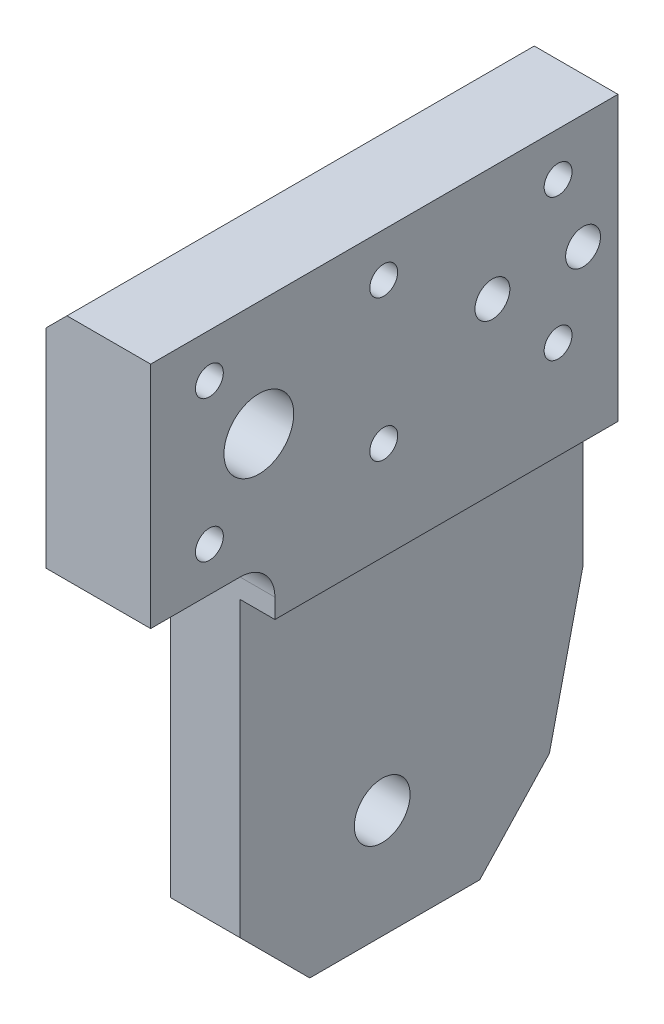
ISO-10303-21;
HEADER;
FILE_DESCRIPTION(('STEP AP214'),'2;1');
FILE_NAME('part.step','',(''),(''),'','','');
FILE_SCHEMA(('AUTOMOTIVE_DESIGN { 1 0 10303 214 1 1 1 1 }'));
ENDSEC;
DATA;
#1=APPLICATION_CONTEXT('core data for automotive mechanical design processes');
#2=APPLICATION_PROTOCOL_DEFINITION('international standard','automotive_design',2000,#1);
#3=PRODUCT_CONTEXT('',#1,'mechanical');
#4=PRODUCT('Part','Part','',(#3));
#5=PRODUCT_RELATED_PRODUCT_CATEGORY('part','',(#4));
#6=PRODUCT_DEFINITION_FORMATION('','',#4);
#7=PRODUCT_DEFINITION_CONTEXT('part definition',#1,'design');
#8=PRODUCT_DEFINITION('design','',#6,#7);
#9=PRODUCT_DEFINITION_SHAPE('','',#8);
#10=(LENGTH_UNIT() NAMED_UNIT(*) SI_UNIT(.MILLI.,.METRE.));
#11=(NAMED_UNIT(*) PLANE_ANGLE_UNIT() SI_UNIT($,.RADIAN.));
#12=(NAMED_UNIT(*) SI_UNIT($,.STERADIAN.) SOLID_ANGLE_UNIT());
#13=UNCERTAINTY_MEASURE_WITH_UNIT(LENGTH_MEASURE(1.E-05),#10,'distance_accuracy_value','');
#14=(GEOMETRIC_REPRESENTATION_CONTEXT(3) GLOBAL_UNCERTAINTY_ASSIGNED_CONTEXT((#13)) GLOBAL_UNIT_ASSIGNED_CONTEXT((#10,
#11,#12)) REPRESENTATION_CONTEXT('',''));
#15=CARTESIAN_POINT('',(0.,0.,0.));
#16=DIRECTION('',(0.,0.,1.));
#17=DIRECTION('',(1.,0.,0.));
#18=AXIS2_PLACEMENT_3D('',#15,#16,#17);
#19=CARTESIAN_POINT('',(0.,-6.08081400829714,16.));
#20=DIRECTION('',(-1.,0.,0.));
#21=DIRECTION('',(0.,0.,1.));
#22=AXIS2_PLACEMENT_3D('',#19,#20,#21);
#23=CYLINDRICAL_SURFACE('',#22,2.);
#24=CARTESIAN_POINT('',(0.,-6.08081400829714,16.));
#25=DIRECTION('',(-1.,0.,0.));
#26=DIRECTION('',(0.,0.,1.));
#27=AXIS2_PLACEMENT_3D('',#24,#25,#26);
#28=CIRCLE('',#27,2.);
#29=CARTESIAN_POINT('',(0.,-6.08081400829714,18.));
#30=VERTEX_POINT('',#29);
#31=EDGE_CURVE('E325',#30,#30,#28,.T.);
#32=ORIENTED_EDGE('',*,*,#31,.F.);
#33=EDGE_LOOP('',(#32));
#34=FACE_BOUND('',#33,.T.);
#35=CARTESIAN_POINT('',(-13.5,-6.08081400829714,16.));
#36=DIRECTION('',(-1.,0.,0.));
#37=DIRECTION('',(0.,0.,1.));
#38=AXIS2_PLACEMENT_3D('',#35,#36,#37);
#39=CIRCLE('',#38,2.);
#40=CARTESIAN_POINT('',(-13.5,-6.08081400829714,18.));
#41=VERTEX_POINT('',#40);
#42=EDGE_CURVE('E241',#41,#41,#39,.F.);
#43=ORIENTED_EDGE('',*,*,#42,.F.);
#44=EDGE_LOOP('',(#43));
#45=FACE_BOUND('',#44,.T.);
#46=ADVANCED_FACE('F31',(#34,#45),#23,.F.);
#47=CARTESIAN_POINT('',(0.,-6.08081400829714,-9.));
#48=DIRECTION('',(-1.,0.,0.));
#49=DIRECTION('',(0.,0.,1.));
#50=AXIS2_PLACEMENT_3D('',#47,#48,#49);
#51=CYLINDRICAL_SURFACE('',#50,2.);
#52=CARTESIAN_POINT('',(0.,-6.08081400829714,-9.));
#53=DIRECTION('',(-1.,0.,0.));
#54=DIRECTION('',(0.,0.,1.));
#55=AXIS2_PLACEMENT_3D('',#52,#53,#54);
#56=CIRCLE('',#55,2.);
#57=CARTESIAN_POINT('',(0.,-6.08081400829714,-7.));
#58=VERTEX_POINT('',#57);
#59=EDGE_CURVE('E322',#58,#58,#56,.T.);
#60=ORIENTED_EDGE('',*,*,#59,.F.);
#61=EDGE_LOOP('',(#60));
#62=FACE_BOUND('',#61,.T.);
#63=CARTESIAN_POINT('',(-13.5,-6.08081400829714,-9.));
#64=DIRECTION('',(-1.,0.,0.));
#65=DIRECTION('',(0.,0.,1.));
#66=AXIS2_PLACEMENT_3D('',#63,#64,#65);
#67=CIRCLE('',#66,2.);
#68=CARTESIAN_POINT('',(-13.5,-6.08081400829714,-7.));
#69=VERTEX_POINT('',#68);
#70=EDGE_CURVE('E236',#69,#69,#67,.F.);
#71=ORIENTED_EDGE('',*,*,#70,.F.);
#72=EDGE_LOOP('',(#71));
#73=FACE_BOUND('',#72,.T.);
#74=ADVANCED_FACE('F398',(#62,#73),#51,.F.);
#75=CARTESIAN_POINT('',(0.,-6.08081400829714,-34.));
#76=DIRECTION('',(-1.,0.,0.));
#77=DIRECTION('',(0.,0.,1.));
#78=AXIS2_PLACEMENT_3D('',#75,#76,#77);
#79=CYLINDRICAL_SURFACE('',#78,2.);
#80=CARTESIAN_POINT('',(0.,-6.08081400829714,-34.));
#81=DIRECTION('',(-1.,0.,0.));
#82=DIRECTION('',(0.,0.,1.));
#83=AXIS2_PLACEMENT_3D('',#80,#81,#82);
#84=CIRCLE('',#83,2.);
#85=CARTESIAN_POINT('',(0.,-6.08081400829714,-32.));
#86=VERTEX_POINT('',#85);
#87=EDGE_CURVE('E317',#86,#86,#84,.T.);
#88=ORIENTED_EDGE('',*,*,#87,.F.);
#89=EDGE_LOOP('',(#88));
#90=FACE_BOUND('',#89,.T.);
#91=CARTESIAN_POINT('',(-13.5,-6.08081400829714,-34.));
#92=DIRECTION('',(-1.,0.,0.));
#93=DIRECTION('',(0.,0.,1.));
#94=AXIS2_PLACEMENT_3D('',#91,#92,#93);
#95=CIRCLE('',#94,2.);
#96=CARTESIAN_POINT('',(-13.5,-6.08081400829714,-32.));
#97=VERTEX_POINT('',#96);
#98=EDGE_CURVE('E231',#97,#97,#95,.F.);
#99=ORIENTED_EDGE('',*,*,#98,.F.);
#100=EDGE_LOOP('',(#99));
#101=FACE_BOUND('',#100,.T.);
#102=ADVANCED_FACE('F404',(#90,#101),#79,.F.);
#103=CARTESIAN_POINT('',(-15.,-60.8316637705877,-42.5815650244091));
#104=DIRECTION('',(0.,-0.224807713484508,-0.974403146525024));
#105=DIRECTION('',(0.,0.974403146525024,-0.224807713484508));
#106=AXIS2_PLACEMENT_3D('',#103,#104,#105);
#107=PLANE('',#106);
#108=DIRECTION('',(0.,0.974403146525024,-0.224807713484508));
#109=VECTOR('',#108,1.);
#110=CARTESIAN_POINT('',(-5.00435815666289,-60.8316637705877,-42.5815650244091));
#111=LINE('',#110,#109);
#112=CARTESIAN_POINT('',(-5.00435815666289,-81.7242328947424,-37.7613725708355));
#113=VERTEX_POINT('',#112);
#114=CARTESIAN_POINT('',(-5.00435815666289,-60.8316637705877,-42.5815650244091));
#115=VERTEX_POINT('',#114);
#116=EDGE_CURVE('E134',#113,#115,#111,.T.);
#117=ORIENTED_EDGE('',*,*,#116,.F.);
#118=DIRECTION('',(-1.,0.,0.));
#119=VECTOR('',#118,1.);
#120=CARTESIAN_POINT('',(-15.,-81.7242328947424,-37.7613725708355));
#121=LINE('',#120,#119);
#122=CARTESIAN_POINT('',(-15.,-81.7242328947424,-37.7613725708355));
#123=VERTEX_POINT('',#122);
#124=EDGE_CURVE('E217',#113,#123,#121,.T.);
#125=ORIENTED_EDGE('',*,*,#124,.T.);
#126=DIRECTION('',(0.,0.974403146525024,-0.224807713484508));
#127=VECTOR('',#126,1.);
#128=CARTESIAN_POINT('',(-15.,-60.8316637705877,-42.5815650244091));
#129=LINE('',#128,#127);
#130=CARTESIAN_POINT('',(-15.,-60.8316637705877,-42.5815650244091));
#131=VERTEX_POINT('',#130);
#132=EDGE_CURVE('E164',#123,#131,#129,.T.);
#133=ORIENTED_EDGE('',*,*,#132,.T.);
#134=DIRECTION('',(1.,0.,0.));
#135=VECTOR('',#134,1.);
#136=CARTESIAN_POINT('',(-15.,-60.8316637705877,-42.5815650244091));
#137=LINE('',#136,#135);
#138=EDGE_CURVE('E179',#131,#115,#137,.T.);
#139=ORIENTED_EDGE('',*,*,#138,.T.);
#140=EDGE_LOOP('',(#117,#125,#133,#139));
#141=FACE_BOUND('',#140,.T.);
#142=ADVANCED_FACE('F299',(#141),#107,.T.);
#143=CARTESIAN_POINT('',(-15.,-92.4426675065177,6.60217121011694));
#144=DIRECTION('',(0.,-1.,0.));
#145=DIRECTION('',(0.,0.,-1.));
#146=AXIS2_PLACEMENT_3D('',#143,#144,#145);
#147=PLANE('',#146);
#148=DIRECTION('',(0.,0.,-1.));
#149=VECTOR('',#148,1.);
#150=CARTESIAN_POINT('',(-15.,-92.4426675065177,6.60217121011694));
#151=LINE('',#150,#149);
#152=CARTESIAN_POINT('',(-15.,-92.4426675065177,-3.39782878988313));
#153=VERTEX_POINT('',#152);
#154=CARTESIAN_POINT('',(-15.,-92.4426675065177,-27.7692181074474));
#155=VERTEX_POINT('',#154);
#156=EDGE_CURVE('E176',#153,#155,#151,.T.);
#157=ORIENTED_EDGE('',*,*,#156,.T.);
#158=DIRECTION('',(1.,0.,0.));
#159=VECTOR('',#158,1.);
#160=CARTESIAN_POINT('',(-15.,-92.4426675065177,-27.7692181074474));
#161=LINE('',#160,#159);
#162=CARTESIAN_POINT('',(-5.00435815666289,-92.4426675065177,-27.7692181074474));
#163=VERTEX_POINT('',#162);
#164=EDGE_CURVE('E212',#155,#163,#161,.T.);
#165=ORIENTED_EDGE('',*,*,#164,.T.);
#166=DIRECTION('',(0.,0.,-1.));
#167=VECTOR('',#166,1.);
#168=CARTESIAN_POINT('',(-5.00435815666289,-92.4426675065177,6.60217121011694));
#169=LINE('',#168,#167);
#170=CARTESIAN_POINT('',(-5.00435815666289,-92.4426675065177,-3.39782878988312));
#171=VERTEX_POINT('',#170);
#172=EDGE_CURVE('E158',#171,#163,#169,.T.);
#173=ORIENTED_EDGE('',*,*,#172,.F.);
#174=DIRECTION('',(-1.,0.,0.));
#175=VECTOR('',#174,1.);
#176=CARTESIAN_POINT('',(-15.,-92.4426675065177,-3.39782878988312));
#177=LINE('',#176,#175);
#178=EDGE_CURVE('E207',#171,#153,#177,.T.);
#179=ORIENTED_EDGE('',*,*,#178,.T.);
#180=EDGE_LOOP('',(#157,#165,#173,#179));
#181=FACE_BOUND('',#180,.T.);
#182=ADVANCED_FACE('F285',(#181),#147,.T.);
#183=CARTESIAN_POINT('',(-15.,-92.4426675065177,6.60217121011694));
#184=DIRECTION('',(0.,0.,1.));
#185=DIRECTION('',(1.,0.,0.));
#186=AXIS2_PLACEMENT_3D('',#183,#184,#185);
#187=PLANE('',#186);
#188=DIRECTION('',(0.,-1.,0.));
#189=VECTOR('',#188,1.);
#190=CARTESIAN_POINT('',(0.,-92.4426675065177,6.60217121011694));
#191=LINE('',#190,#189);
#192=CARTESIAN_POINT('',(0.,-37.6500207262163,6.60217121011694));
#193=VERTEX_POINT('',#192);
#194=CARTESIAN_POINT('',(0.,-40.4274289166685,6.60217121011694));
#195=VERTEX_POINT('',#194);
#196=EDGE_CURVE('E167',#193,#195,#191,.T.);
#197=ORIENTED_EDGE('',*,*,#196,.F.);
#198=DIRECTION('',(1.,0.,0.));
#199=VECTOR('',#198,1.);
#200=CARTESIAN_POINT('',(-15.,-37.6500207262163,6.60217121011694));
#201=LINE('',#200,#199);
#202=CARTESIAN_POINT('',(-15.,-37.6500207262163,6.60217121011694));
#203=VERTEX_POINT('',#202);
#204=EDGE_CURVE('E224',#193,#203,#201,.F.);
#205=ORIENTED_EDGE('',*,*,#204,.T.);
#206=DIRECTION('',(0.,-1.,0.));
#207=VECTOR('',#206,1.);
#208=CARTESIAN_POINT('',(-15.,-92.4426675065177,6.60217121011694));
#209=LINE('',#208,#207);
#210=CARTESIAN_POINT('',(-15.,-82.4426675065177,6.60217121011694));
#211=VERTEX_POINT('',#210);
#212=EDGE_CURVE('E174',#203,#211,#209,.T.);
#213=ORIENTED_EDGE('',*,*,#212,.T.);
#214=DIRECTION('',(1.,0.,0.));
#215=VECTOR('',#214,1.);
#216=CARTESIAN_POINT('',(-15.,-82.4426675065177,6.60217121011694));
#217=LINE('',#216,#215);
#218=CARTESIAN_POINT('',(-5.00435815666289,-82.4426675065177,6.60217121011694));
#219=VERTEX_POINT('',#218);
#220=EDGE_CURVE('E202',#211,#219,#217,.T.);
#221=ORIENTED_EDGE('',*,*,#220,.T.);
#222=DIRECTION('',(0.,-1.,0.));
#223=VECTOR('',#222,1.);
#224=CARTESIAN_POINT('',(-5.00435815666289,-92.4426675065177,6.60217121011694));
#225=LINE('',#224,#223);
#226=CARTESIAN_POINT('',(-5.00435815666289,-40.4274289166685,6.60217121011694));
#227=VERTEX_POINT('',#226);
#228=EDGE_CURVE('E154',#227,#219,#225,.T.);
#229=ORIENTED_EDGE('',*,*,#228,.F.);
#230=DIRECTION('',(-1.,0.,0.));
#231=VECTOR('',#230,1.);
#232=CARTESIAN_POINT('',(-15.,-40.4274289166685,6.60217121011694));
#233=LINE('',#232,#231);
#234=EDGE_CURVE('E147',#195,#227,#233,.T.);
#235=ORIENTED_EDGE('',*,*,#234,.F.);
#236=EDGE_LOOP('',(#197,#205,#213,#221,#229,#235));
#237=FACE_BOUND('',#236,.T.);
#238=ADVANCED_FACE('F278',(#237),#187,.T.);
#239=CARTESIAN_POINT('',(-15.,-32.6500207262163,24.4184349755909));
#240=DIRECTION('',(0.,-1.,0.));
#241=DIRECTION('',(0.,0.,-1.));
#242=AXIS2_PLACEMENT_3D('',#239,#240,#241);
#243=PLANE('',#242);
#244=DIRECTION('',(0.,0.,-1.));
#245=VECTOR('',#244,1.);
#246=CARTESIAN_POINT('',(-15.,-32.6500207262163,24.4184349755909));
#247=LINE('',#246,#245);
#248=CARTESIAN_POINT('',(-15.,-32.6500207262163,24.4184349755909));
#249=VERTEX_POINT('',#248);
#250=CARTESIAN_POINT('',(-15.,-32.6500207262163,11.6021712101169));
#251=VERTEX_POINT('',#250);
#252=EDGE_CURVE('E171',#249,#251,#247,.T.);
#253=ORIENTED_EDGE('',*,*,#252,.T.);
#254=DIRECTION('',(1.,0.,0.));
#255=VECTOR('',#254,1.);
#256=CARTESIAN_POINT('',(0.,-32.6500207262163,11.6021712101169));
#257=LINE('',#256,#255);
#258=CARTESIAN_POINT('',(0.,-32.6500207262163,11.6021712101169));
#259=VERTEX_POINT('',#258);
#260=EDGE_CURVE('E221',#251,#259,#257,.T.);
#261=ORIENTED_EDGE('',*,*,#260,.T.);
#262=DIRECTION('',(0.,0.,-1.));
#263=VECTOR('',#262,1.);
#264=CARTESIAN_POINT('',(0.,-32.6500207262163,24.4184349755909));
#265=LINE('',#264,#263);
#266=CARTESIAN_POINT('',(0.,-32.6500207262163,24.4184349755909));
#267=VERTEX_POINT('',#266);
#268=EDGE_CURVE('E187',#267,#259,#265,.T.);
#269=ORIENTED_EDGE('',*,*,#268,.F.);
#270=DIRECTION('',(1.,0.,0.));
#271=VECTOR('',#270,1.);
#272=CARTESIAN_POINT('',(-15.,-32.6500207262163,24.4184349755909));
#273=LINE('',#272,#271);
#274=EDGE_CURVE('E191',#249,#267,#273,.T.);
#275=ORIENTED_EDGE('',*,*,#274,.F.);
#276=EDGE_LOOP('',(#253,#261,#269,#275));
#277=FACE_BOUND('',#276,.T.);
#278=ADVANCED_FACE('F620',(#277),#243,.T.);
#279=CARTESIAN_POINT('',(-15.,-32.6500207262163,24.4184349755909));
#280=DIRECTION('',(0.,3.31181144600806E-10,1.));
#281=DIRECTION('',(0.,-1.,3.31181144600806E-10));
#282=AXIS2_PLACEMENT_3D('',#279,#280,#281);
#283=PLANE('',#282);
#284=DIRECTION('',(1.,0.,0.));
#285=VECTOR('',#284,1.);
#286=CARTESIAN_POINT('',(-15.,0.195067042427263,24.4184349647132));
#287=LINE('',#286,#285);
#288=CARTESIAN_POINT('',(-12.,0.195067042427265,24.4184349647132));
#289=VERTEX_POINT('',#288);
#290=CARTESIAN_POINT('',(0.,0.195067042427263,24.4184349647132));
#291=VERTEX_POINT('',#290);
#292=EDGE_CURVE('E194',#289,#291,#287,.T.);
#293=ORIENTED_EDGE('',*,*,#292,.F.);
#294=DIRECTION('',(-0.707106781186548,-0.707106781186548,2.34180433148352E-10));
#295=VECTOR('',#294,1.);
#296=CARTESIAN_POINT('',(-29.9225438843218,-17.7274768418945,24.4184349706489));
#297=LINE('',#296,#295);
#298=CARTESIAN_POINT('',(-15.,-2.80493295757274,24.4184349657068));
#299=VERTEX_POINT('',#298);
#300=EDGE_CURVE('E53',#289,#299,#297,.T.);
#301=ORIENTED_EDGE('',*,*,#300,.T.);
#302=DIRECTION('',(0.,-1.,3.31181144600806E-10));
#303=VECTOR('',#302,1.);
#304=CARTESIAN_POINT('',(-15.,-32.6500207262163,24.4184349755909));
#305=LINE('',#304,#303);
#306=EDGE_CURVE('E169',#299,#249,#305,.T.);
#307=ORIENTED_EDGE('',*,*,#306,.T.);
#308=ORIENTED_EDGE('',*,*,#274,.T.);
#309=DIRECTION('',(0.,-1.,3.31181144600806E-10));
#310=VECTOR('',#309,1.);
#311=CARTESIAN_POINT('',(0.,-32.6500207262163,24.4184349755909));
#312=LINE('',#311,#310);
#313=EDGE_CURVE('E184',#291,#267,#312,.T.);
#314=ORIENTED_EDGE('',*,*,#313,.F.);
#315=EDGE_LOOP('',(#293,#301,#307,#308,#314));
#316=FACE_BOUND('',#315,.T.);
#317=ADVANCED_FACE('F271',(#316),#283,.T.);
#318=CARTESIAN_POINT('',(-15.,0.195067042427263,24.4184349647132));
#319=DIRECTION('',(0.,1.,0.));
#320=DIRECTION('',(0.,0.,1.));
#321=AXIS2_PLACEMENT_3D('',#318,#319,#320);
#322=PLANE('',#321);
#323=DIRECTION('',(1.,0.,0.));
#324=VECTOR('',#323,1.);
#325=CARTESIAN_POINT('',(-15.,0.195067042427263,-42.5815650244091));
#326=LINE('',#325,#324);
#327=CARTESIAN_POINT('',(-12.,0.195067042427263,-42.5815650244091));
#328=VERTEX_POINT('',#327);
#329=CARTESIAN_POINT('',(0.,0.195067042427263,-42.5815650244091));
#330=VERTEX_POINT('',#329);
#331=EDGE_CURVE('E196',#328,#330,#326,.T.);
#332=ORIENTED_EDGE('',*,*,#331,.F.);
#333=DIRECTION('',(0.,0.,1.));
#334=VECTOR('',#333,1.);
#335=CARTESIAN_POINT('',(-12.,0.195067042427263,24.4184349647132));
#336=LINE('',#335,#334);
#337=EDGE_CURVE('E230',#328,#289,#336,.T.);
#338=ORIENTED_EDGE('',*,*,#337,.T.);
#339=ORIENTED_EDGE('',*,*,#292,.T.);
#340=DIRECTION('',(0.,0.,1.));
#341=VECTOR('',#340,1.);
#342=CARTESIAN_POINT('',(0.,0.195067042427263,24.4184349647132));
#343=LINE('',#342,#341);
#344=EDGE_CURVE('E181',#330,#291,#343,.T.);
#345=ORIENTED_EDGE('',*,*,#344,.F.);
#346=EDGE_LOOP('',(#332,#338,#339,#345));
#347=FACE_BOUND('',#346,.T.);
#348=ADVANCED_FACE('F266',(#347),#322,.T.);
#349=CARTESIAN_POINT('',(-15.,0.195067042427263,-42.5815650244091));
#350=DIRECTION('',(0.,0.,-1.));
#351=DIRECTION('',(0.,1.,0.));
#352=AXIS2_PLACEMENT_3D('',#349,#350,#351);
#353=PLANE('',#352);
#354=DIRECTION('',(0.,1.,0.));
#355=VECTOR('',#354,1.);
#356=CARTESIAN_POINT('',(-15.,0.195067042427263,-42.5815650244091));
#357=LINE('',#356,#355);
#358=CARTESIAN_POINT('',(-15.,-2.80493295757274,-42.5815650244091));
#359=VERTEX_POINT('',#358);
#360=EDGE_CURVE('E166',#131,#359,#357,.T.);
#361=ORIENTED_EDGE('',*,*,#360,.T.);
#362=DIRECTION('',(0.707106781186548,0.707106781186548,0.));
#363=VECTOR('',#362,1.);
#364=CARTESIAN_POINT('',(-13.5,-1.30493295757274,-42.5815650244091));
#365=LINE('',#364,#363);
#366=EDGE_CURVE('E11',#359,#328,#365,.T.);
#367=ORIENTED_EDGE('',*,*,#366,.T.);
#368=ORIENTED_EDGE('',*,*,#331,.T.);
#369=DIRECTION('',(0.,1.,0.));
#370=VECTOR('',#369,1.);
#371=CARTESIAN_POINT('',(0.,0.195067042427263,-42.5815650244091));
#372=LINE('',#371,#370);
#373=CARTESIAN_POINT('',(0.,-40.4274289166685,-42.5815650244091));
#374=VERTEX_POINT('',#373);
#375=EDGE_CURVE('E153',#374,#330,#372,.T.);
#376=ORIENTED_EDGE('',*,*,#375,.F.);
#377=DIRECTION('',(1.,0.,0.));
#378=VECTOR('',#377,1.);
#379=CARTESIAN_POINT('',(-15.,-40.4274289166685,-42.5815650244091));
#380=LINE('',#379,#378);
#381=CARTESIAN_POINT('',(-5.00435815666289,-40.4274289166685,-42.5815650244091));
#382=VERTEX_POINT('',#381);
#383=EDGE_CURVE('E144',#382,#374,#380,.T.);
#384=ORIENTED_EDGE('',*,*,#383,.F.);
#385=DIRECTION('',(0.,1.,0.));
#386=VECTOR('',#385,1.);
#387=CARTESIAN_POINT('',(-5.00435815666289,0.195067042427263,-42.5815650244091));
#388=LINE('',#387,#386);
#389=EDGE_CURVE('E125',#115,#382,#388,.T.);
#390=ORIENTED_EDGE('',*,*,#389,.F.);
#391=ORIENTED_EDGE('',*,*,#138,.F.);
#392=EDGE_LOOP('',(#361,#367,#368,#376,#384,#390,#391));
#393=FACE_BOUND('',#392,.T.);
#394=ADVANCED_FACE('F151',(#393),#353,.T.);
#395=CARTESIAN_POINT('',(-15.,-92.4426675065177,-35.2884877225059));
#396=DIRECTION('',(1.,0.,0.));
#397=DIRECTION('',(0.,0.,-1.));
#398=AXIS2_PLACEMENT_3D('',#395,#396,#397);
#399=PLANE('',#398);
#400=CARTESIAN_POINT('',(-15.,-26.3741397165486,-34.));
#401=DIRECTION('',(-1.,0.,0.));
#402=DIRECTION('',(0.,0.,-1.));
#403=AXIS2_PLACEMENT_3D('',#400,#401,#402);
#404=CIRCLE('',#403,3.);
#405=CARTESIAN_POINT('',(-15.,-26.3741397165486,-37.));
#406=VERTEX_POINT('',#405);
#407=EDGE_CURVE('E358',#406,#406,#404,.T.);
#408=ORIENTED_EDGE('',*,*,#407,.F.);
#409=EDGE_LOOP('',(#408));
#410=FACE_BOUND('',#409,.T.);
#411=CARTESIAN_POINT('',(-15.,-26.3741397165486,-9.));
#412=DIRECTION('',(-1.,0.,0.));
#413=DIRECTION('',(0.,0.,-1.));
#414=AXIS2_PLACEMENT_3D('',#411,#412,#413);
#415=CIRCLE('',#414,3.);
#416=CARTESIAN_POINT('',(-15.,-26.3741397165486,-12.));
#417=VERTEX_POINT('',#416);
#418=EDGE_CURVE('E259',#417,#417,#415,.T.);
#419=ORIENTED_EDGE('',*,*,#418,.F.);
#420=EDGE_LOOP('',(#419));
#421=FACE_BOUND('',#420,.T.);
#422=CARTESIAN_POINT('',(-15.,-26.3741397165486,16.));
#423=DIRECTION('',(-1.,0.,0.));
#424=DIRECTION('',(0.,0.,-1.));
#425=AXIS2_PLACEMENT_3D('',#422,#423,#424);
#426=CIRCLE('',#425,3.);
#427=CARTESIAN_POINT('',(-15.,-26.3741397165486,13.));
#428=VERTEX_POINT('',#427);
#429=EDGE_CURVE('E254',#428,#428,#426,.T.);
#430=ORIENTED_EDGE('',*,*,#429,.F.);
#431=EDGE_LOOP('',(#430));
#432=FACE_BOUND('',#431,.T.);
#433=CARTESIAN_POINT('',(-15.,-6.08081400829714,16.));
#434=DIRECTION('',(-1.,0.,0.));
#435=DIRECTION('',(0.,0.,1.));
#436=AXIS2_PLACEMENT_3D('',#433,#434,#435);
#437=CIRCLE('',#436,3.);
#438=CARTESIAN_POINT('',(-15.,-6.08081400829714,19.));
#439=VERTEX_POINT('',#438);
#440=EDGE_CURVE('E249',#439,#439,#437,.T.);
#441=ORIENTED_EDGE('',*,*,#440,.F.);
#442=EDGE_LOOP('',(#441));
#443=FACE_BOUND('',#442,.T.);
#444=CARTESIAN_POINT('',(-15.,-6.08081400829714,-9.));
#445=DIRECTION('',(-1.,0.,0.));
#446=DIRECTION('',(0.,0.,1.));
#447=AXIS2_PLACEMENT_3D('',#444,#445,#446);
#448=CIRCLE('',#447,3.);
#449=CARTESIAN_POINT('',(-15.,-6.08081400829714,-6.));
#450=VERTEX_POINT('',#449);
#451=EDGE_CURVE('E244',#450,#450,#448,.T.);
#452=ORIENTED_EDGE('',*,*,#451,.F.);
#453=EDGE_LOOP('',(#452));
#454=FACE_BOUND('',#453,.T.);
#455=CARTESIAN_POINT('',(-15.,-6.08081400829714,-34.));
#456=DIRECTION('',(-1.,0.,0.));
#457=DIRECTION('',(0.,0.,1.));
#458=AXIS2_PLACEMENT_3D('',#455,#456,#457);
#459=CIRCLE('',#458,3.);
#460=CARTESIAN_POINT('',(-15.,-6.08081400829714,-31.));
#461=VERTEX_POINT('',#460);
#462=EDGE_CURVE('E239',#461,#461,#459,.T.);
#463=ORIENTED_EDGE('',*,*,#462,.F.);
#464=EDGE_LOOP('',(#463));
#465=FACE_BOUND('',#464,.T.);
#466=CARTESIAN_POINT('',(-15.,-16.2274768624229,-24.5815650541918));
#467=DIRECTION('',(-1.,0.,0.));
#468=DIRECTION('',(0.,0.,1.));
#469=AXIS2_PLACEMENT_3D('',#466,#467,#468);
#470=CIRCLE('',#469,2.5);
#471=CARTESIAN_POINT('',(-15.,-16.2274768624229,-22.0815650541918));
#472=VERTEX_POINT('',#471);
#473=EDGE_CURVE('E314',#472,#472,#470,.T.);
#474=ORIENTED_EDGE('',*,*,#473,.F.);
#475=EDGE_LOOP('',(#474));
#476=FACE_BOUND('',#475,.T.);
#477=CARTESIAN_POINT('',(-15.,-16.2274768624229,-37.5815650541918));
#478=DIRECTION('',(-1.,0.,0.));
#479=DIRECTION('',(0.,0.,1.));
#480=AXIS2_PLACEMENT_3D('',#477,#478,#479);
#481=CIRCLE('',#480,2.49999999999999);
#482=CARTESIAN_POINT('',(-15.,-16.2274768624229,-35.0815650541918));
#483=VERTEX_POINT('',#482);
#484=EDGE_CURVE('E308',#483,#483,#481,.T.);
#485=ORIENTED_EDGE('',*,*,#484,.F.);
#486=EDGE_LOOP('',(#485));
#487=FACE_BOUND('',#486,.T.);
#488=CARTESIAN_POINT('',(-15.,-16.2274768470333,8.90469038538057));
#489=DIRECTION('',(-1.,0.,0.));
#490=DIRECTION('',(0.,0.,1.));
#491=AXIS2_PLACEMENT_3D('',#488,#489,#490);
#492=CIRCLE('',#491,5.00000000000015);
#493=CARTESIAN_POINT('',(-15.,-16.2274768470333,13.9046903853807));
#494=VERTEX_POINT('',#493);
#495=EDGE_CURVE('E302',#494,#494,#492,.T.);
#496=ORIENTED_EDGE('',*,*,#495,.F.);
#497=EDGE_LOOP('',(#496));
#498=FACE_BOUND('',#497,.T.);
#499=CARTESIAN_POINT('',(-15.,-76.8340024966243,-13.784244496519));
#500=DIRECTION('',(1.,0.,0.));
#501=DIRECTION('',(0.,0.,-1.));
#502=AXIS2_PLACEMENT_3D('',#499,#500,#501);
#503=CIRCLE('',#502,4.);
#504=CARTESIAN_POINT('',(-15.,-76.8340024966243,-17.7842444965191));
#505=VERTEX_POINT('',#504);
#506=EDGE_CURVE('E156',#505,#505,#503,.T.);
#507=ORIENTED_EDGE('',*,*,#506,.T.);
#508=EDGE_LOOP('',(#507));
#509=FACE_BOUND('',#508,.T.);
#510=ORIENTED_EDGE('',*,*,#306,.F.);
#511=DIRECTION('',(0.,0.,-1.));
#512=VECTOR('',#511,1.);
#513=CARTESIAN_POINT('',(-15.,-2.80493295757274,-42.5815650244091));
#514=LINE('',#513,#512);
#515=EDGE_CURVE('E39',#299,#359,#514,.T.);
#516=ORIENTED_EDGE('',*,*,#515,.T.);
#517=ORIENTED_EDGE('',*,*,#360,.F.);
#518=ORIENTED_EDGE('',*,*,#132,.F.);
#519=DIRECTION('',(0.,0.731454021675909,-0.681890764106788));
#520=VECTOR('',#519,1.);
#521=CARTESIAN_POINT('',(-15.,-92.4426675065177,-27.7692181074474));
#522=LINE('',#521,#520);
#523=EDGE_CURVE('E219',#123,#155,#522,.F.);
#524=ORIENTED_EDGE('',*,*,#523,.T.);
#525=ORIENTED_EDGE('',*,*,#156,.F.);
#526=DIRECTION('',(0.,-0.707106781186546,-0.70710678118655));
#527=VECTOR('',#526,1.);
#528=CARTESIAN_POINT('',(-15.,-82.4426675065177,6.60217121011694));
#529=LINE('',#528,#527);
#530=EDGE_CURVE('E209',#153,#211,#529,.F.);
#531=ORIENTED_EDGE('',*,*,#530,.T.);
#532=ORIENTED_EDGE('',*,*,#212,.F.);
#533=CARTESIAN_POINT('',(-15.,-37.6500207262163,11.6021712101169));
#534=DIRECTION('',(1.,0.,0.));
#535=DIRECTION('',(0.,0.,-1.));
#536=AXIS2_PLACEMENT_3D('',#533,#534,#535);
#537=CIRCLE('',#536,5.);
#538=EDGE_CURVE('E228',#203,#251,#537,.T.);
#539=ORIENTED_EDGE('',*,*,#538,.T.);
#540=ORIENTED_EDGE('',*,*,#252,.F.);
#541=EDGE_LOOP('',(#510,#516,#517,#518,#524,#525,#531,#532,#539,#540));
#542=FACE_BOUND('',#541,.T.);
#543=ADVANCED_FACE('F291',(#410,#421,#432,#443,#454,#465,#476,#487,#498,#509,#542),#399,.F.);
#544=CARTESIAN_POINT('',(0.,-92.4426675065177,-35.2884877225059));
#545=DIRECTION('',(1.,0.,0.));
#546=DIRECTION('',(0.,0.,-1.));
#547=AXIS2_PLACEMENT_3D('',#544,#545,#546);
#548=PLANE('',#547);
#549=CARTESIAN_POINT('',(0.,-26.3741397165486,-34.));
#550=DIRECTION('',(-1.,0.,0.));
#551=DIRECTION('',(0.,0.,-1.));
#552=AXIS2_PLACEMENT_3D('',#549,#550,#551);
#553=CIRCLE('',#552,2.);
#554=CARTESIAN_POINT('',(0.,-26.3741397165486,-36.));
#555=VERTEX_POINT('',#554);
#556=EDGE_CURVE('E234',#555,#555,#553,.T.);
#557=ORIENTED_EDGE('',*,*,#556,.T.);
#558=EDGE_LOOP('',(#557));
#559=FACE_BOUND('',#558,.T.);
#560=CARTESIAN_POINT('',(0.,-26.3741397165486,-9.));
#561=DIRECTION('',(-1.,0.,0.));
#562=DIRECTION('',(0.,0.,-1.));
#563=AXIS2_PLACEMENT_3D('',#560,#561,#562);
#564=CIRCLE('',#563,2.);
#565=CARTESIAN_POINT('',(0.,-26.3741397165486,-11.));
#566=VERTEX_POINT('',#565);
#567=EDGE_CURVE('E331',#566,#566,#564,.T.);
#568=ORIENTED_EDGE('',*,*,#567,.T.);
#569=EDGE_LOOP('',(#568));
#570=FACE_BOUND('',#569,.T.);
#571=CARTESIAN_POINT('',(0.,-26.3741397165486,16.));
#572=DIRECTION('',(-1.,0.,0.));
#573=DIRECTION('',(0.,0.,-1.));
#574=AXIS2_PLACEMENT_3D('',#571,#572,#573);
#575=CIRCLE('',#574,2.);
#576=CARTESIAN_POINT('',(0.,-26.3741397165486,14.));
#577=VERTEX_POINT('',#576);
#578=EDGE_CURVE('E328',#577,#577,#575,.T.);
#579=ORIENTED_EDGE('',*,*,#578,.T.);
#580=EDGE_LOOP('',(#579));
#581=FACE_BOUND('',#580,.T.);
#582=ORIENTED_EDGE('',*,*,#31,.T.);
#583=EDGE_LOOP('',(#582));
#584=FACE_BOUND('',#583,.T.);
#585=ORIENTED_EDGE('',*,*,#59,.T.);
#586=EDGE_LOOP('',(#585));
#587=FACE_BOUND('',#586,.T.);
#588=ORIENTED_EDGE('',*,*,#87,.T.);
#589=EDGE_LOOP('',(#588));
#590=FACE_BOUND('',#589,.T.);
#591=CARTESIAN_POINT('',(0.,-16.2274768624229,-24.5815650541918));
#592=DIRECTION('',(-1.,0.,0.));
#593=DIRECTION('',(0.,0.,1.));
#594=AXIS2_PLACEMENT_3D('',#591,#592,#593);
#595=CIRCLE('',#594,2.5);
#596=CARTESIAN_POINT('',(0.,-16.2274768624229,-22.0815650541918));
#597=VERTEX_POINT('',#596);
#598=EDGE_CURVE('E311',#597,#597,#595,.T.);
#599=ORIENTED_EDGE('',*,*,#598,.T.);
#600=EDGE_LOOP('',(#599));
#601=FACE_BOUND('',#600,.T.);
#602=CARTESIAN_POINT('',(0.,-16.2274768624229,-37.5815650541918));
#603=DIRECTION('',(-1.,0.,0.));
#604=DIRECTION('',(0.,0.,1.));
#605=AXIS2_PLACEMENT_3D('',#602,#603,#604);
#606=CIRCLE('',#605,2.49999999999999);
#607=CARTESIAN_POINT('',(0.,-16.2274768624229,-35.0815650541918));
#608=VERTEX_POINT('',#607);
#609=EDGE_CURVE('E305',#608,#608,#606,.T.);
#610=ORIENTED_EDGE('',*,*,#609,.T.);
#611=EDGE_LOOP('',(#610));
#612=FACE_BOUND('',#611,.T.);
#613=CARTESIAN_POINT('',(0.,-16.2274768470333,8.90469038538057));
#614=DIRECTION('',(-1.,0.,0.));
#615=DIRECTION('',(0.,0.,1.));
#616=AXIS2_PLACEMENT_3D('',#613,#614,#615);
#617=CIRCLE('',#616,5.00000000000015);
#618=CARTESIAN_POINT('',(0.,-16.2274768470333,13.9046903853807));
#619=VERTEX_POINT('',#618);
#620=EDGE_CURVE('E148',#619,#619,#617,.T.);
#621=ORIENTED_EDGE('',*,*,#620,.T.);
#622=EDGE_LOOP('',(#621));
#623=FACE_BOUND('',#622,.T.);
#624=DIRECTION('',(0.,0.,1.));
#625=VECTOR('',#624,1.);
#626=CARTESIAN_POINT('',(0.,-40.4274289166685,-35.2884877225059));
#627=LINE('',#626,#625);
#628=EDGE_CURVE('E193',#374,#195,#627,.T.);
#629=ORIENTED_EDGE('',*,*,#628,.F.);
#630=ORIENTED_EDGE('',*,*,#375,.T.);
#631=ORIENTED_EDGE('',*,*,#344,.T.);
#632=ORIENTED_EDGE('',*,*,#313,.T.);
#633=ORIENTED_EDGE('',*,*,#268,.T.);
#634=CARTESIAN_POINT('',(0.,-37.6500207262163,11.6021712101169));
#635=DIRECTION('',(1.,0.,0.));
#636=DIRECTION('',(0.,0.,-1.));
#637=AXIS2_PLACEMENT_3D('',#634,#635,#636);
#638=CIRCLE('',#637,5.);
#639=EDGE_CURVE('E226',#259,#193,#638,.F.);
#640=ORIENTED_EDGE('',*,*,#639,.T.);
#641=ORIENTED_EDGE('',*,*,#196,.T.);
#642=EDGE_LOOP('',(#629,#630,#631,#632,#633,#640,#641));
#643=FACE_BOUND('',#642,.T.);
#644=ADVANCED_FACE('F275',(#559,#570,#581,#584,#587,#590,#601,#612,#623,#643),#548,.T.);
#645=CARTESIAN_POINT('',(-15.,-76.8340024966243,-13.784244496519));
#646=DIRECTION('',(1.,0.,0.));
#647=DIRECTION('',(0.,0.,-1.));
#648=AXIS2_PLACEMENT_3D('',#645,#646,#647);
#649=CYLINDRICAL_SURFACE('',#648,4.);
#650=CARTESIAN_POINT('',(-5.00435815666289,-76.8340024966243,-13.784244496519));
#651=DIRECTION('',(-1.,0.,0.));
#652=DIRECTION('',(0.,0.,1.));
#653=AXIS2_PLACEMENT_3D('',#650,#651,#652);
#654=CIRCLE('',#653,4.);
#655=CARTESIAN_POINT('',(-5.00435815666289,-76.8340024966243,-9.78424449651905));
#656=VERTEX_POINT('',#655);
#657=EDGE_CURVE('E139',#656,#656,#654,.F.);
#658=ORIENTED_EDGE('',*,*,#657,.T.);
#659=EDGE_LOOP('',(#658));
#660=FACE_BOUND('',#659,.T.);
#661=ORIENTED_EDGE('',*,*,#506,.F.);
#662=EDGE_LOOP('',(#661));
#663=FACE_BOUND('',#662,.T.);
#664=ADVANCED_FACE('F385',(#660,#663),#649,.F.);
#665=CARTESIAN_POINT('',(-5.00435815666289,-40.4274289166685,-55.));
#666=DIRECTION('',(-1.,0.,0.));
#667=DIRECTION('',(0.,0.,1.));
#668=AXIS2_PLACEMENT_3D('',#665,#666,#667);
#669=PLANE('',#668);
#670=ORIENTED_EDGE('',*,*,#172,.T.);
#671=DIRECTION('',(0.,-0.731454021675909,0.681890764106788));
#672=VECTOR('',#671,1.);
#673=CARTESIAN_POINT('',(-5.00435815666289,-92.4426675065177,-27.7692181074474));
#674=LINE('',#673,#672);
#675=EDGE_CURVE('E215',#163,#113,#674,.F.);
#676=ORIENTED_EDGE('',*,*,#675,.T.);
#677=ORIENTED_EDGE('',*,*,#116,.T.);
#678=ORIENTED_EDGE('',*,*,#389,.T.);
#679=DIRECTION('',(0.,0.,1.));
#680=VECTOR('',#679,1.);
#681=CARTESIAN_POINT('',(-5.00435815666289,-40.4274289166685,-55.));
#682=LINE('',#681,#680);
#683=EDGE_CURVE('E131',#382,#227,#682,.T.);
#684=ORIENTED_EDGE('',*,*,#683,.T.);
#685=ORIENTED_EDGE('',*,*,#228,.T.);
#686=DIRECTION('',(0.,0.707106781186546,0.707106781186549));
#687=VECTOR('',#686,1.);
#688=CARTESIAN_POINT('',(-5.00435815666289,-82.4426675065177,6.60217121011694));
#689=LINE('',#688,#687);
#690=EDGE_CURVE('E205',#219,#171,#689,.F.);
#691=ORIENTED_EDGE('',*,*,#690,.T.);
#692=EDGE_LOOP('',(#670,#676,#677,#678,#684,#685,#691));
#693=FACE_BOUND('',#692,.T.);
#694=ORIENTED_EDGE('',*,*,#657,.F.);
#695=EDGE_LOOP('',(#694));
#696=FACE_BOUND('',#695,.T.);
#697=ADVANCED_FACE('F128',(#693,#696),#669,.F.);
#698=CARTESIAN_POINT('',(1.4631591119979,-40.4274289166685,-55.));
#699=DIRECTION('',(0.,1.,0.));
#700=DIRECTION('',(0.,0.,1.));
#701=AXIS2_PLACEMENT_3D('',#698,#699,#700);
#702=PLANE('',#701);
#703=ORIENTED_EDGE('',*,*,#234,.T.);
#704=ORIENTED_EDGE('',*,*,#683,.F.);
#705=ORIENTED_EDGE('',*,*,#383,.T.);
#706=ORIENTED_EDGE('',*,*,#628,.T.);
#707=EDGE_LOOP('',(#703,#704,#705,#706));
#708=FACE_BOUND('',#707,.T.);
#709=ADVANCED_FACE('F142',(#708),#702,.F.);
#710=CARTESIAN_POINT('',(0.,-16.2274768470333,8.90469038538057));
#711=DIRECTION('',(-1.,0.,0.));
#712=DIRECTION('',(0.,0.,1.));
#713=AXIS2_PLACEMENT_3D('',#710,#711,#712);
#714=CYLINDRICAL_SURFACE('',#713,5.00000000000015);
#715=ORIENTED_EDGE('',*,*,#620,.F.);
#716=EDGE_LOOP('',(#715));
#717=FACE_BOUND('',#716,.T.);
#718=ORIENTED_EDGE('',*,*,#495,.T.);
#719=EDGE_LOOP('',(#718));
#720=FACE_BOUND('',#719,.T.);
#721=ADVANCED_FACE('F423',(#717,#720),#714,.F.);
#722=CARTESIAN_POINT('',(0.,-16.2274768624229,-37.5815650541918));
#723=DIRECTION('',(-1.,0.,0.));
#724=DIRECTION('',(0.,0.,1.));
#725=AXIS2_PLACEMENT_3D('',#722,#723,#724);
#726=CYLINDRICAL_SURFACE('',#725,2.49999999999999);
#727=ORIENTED_EDGE('',*,*,#609,.F.);
#728=EDGE_LOOP('',(#727));
#729=FACE_BOUND('',#728,.T.);
#730=ORIENTED_EDGE('',*,*,#484,.T.);
#731=EDGE_LOOP('',(#730));
#732=FACE_BOUND('',#731,.T.);
#733=ADVANCED_FACE('F419',(#729,#732),#726,.F.);
#734=CARTESIAN_POINT('',(0.,-16.2274768624229,-24.5815650541918));
#735=DIRECTION('',(-1.,0.,0.));
#736=DIRECTION('',(0.,0.,1.));
#737=AXIS2_PLACEMENT_3D('',#734,#735,#736);
#738=CYLINDRICAL_SURFACE('',#737,2.5);
#739=ORIENTED_EDGE('',*,*,#598,.F.);
#740=EDGE_LOOP('',(#739));
#741=FACE_BOUND('',#740,.T.);
#742=ORIENTED_EDGE('',*,*,#473,.T.);
#743=EDGE_LOOP('',(#742));
#744=FACE_BOUND('',#743,.T.);
#745=ADVANCED_FACE('F416',(#741,#744),#738,.F.);
#746=CARTESIAN_POINT('',(-15.,-82.4426675065177,6.60217121011694));
#747=DIRECTION('',(0.,0.707106781186549,-0.707106781186545));
#748=DIRECTION('',(0.,0.707106781186546,0.707106781186549));
#749=AXIS2_PLACEMENT_3D('',#746,#747,#748);
#750=PLANE('',#749);
#751=ORIENTED_EDGE('',*,*,#530,.F.);
#752=ORIENTED_EDGE('',*,*,#178,.F.);
#753=ORIENTED_EDGE('',*,*,#690,.F.);
#754=ORIENTED_EDGE('',*,*,#220,.F.);
#755=EDGE_LOOP('',(#751,#752,#753,#754));
#756=FACE_BOUND('',#755,.T.);
#757=ADVANCED_FACE('F289',(#756),#750,.F.);
#758=CARTESIAN_POINT('',(-15.,-92.4426675065177,-27.7692181074474));
#759=DIRECTION('',(0.,0.681890764106788,0.731454021675909));
#760=DIRECTION('',(0.,-0.731454021675909,0.681890764106788));
#761=AXIS2_PLACEMENT_3D('',#758,#759,#760);
#762=PLANE('',#761);
#763=ORIENTED_EDGE('',*,*,#523,.F.);
#764=ORIENTED_EDGE('',*,*,#124,.F.);
#765=ORIENTED_EDGE('',*,*,#675,.F.);
#766=ORIENTED_EDGE('',*,*,#164,.F.);
#767=EDGE_LOOP('',(#763,#764,#765,#766));
#768=FACE_BOUND('',#767,.T.);
#769=ADVANCED_FACE('F296',(#768),#762,.F.);
#770=CARTESIAN_POINT('',(-15.,-37.6500207262163,11.6021712101169));
#771=DIRECTION('',(-1.,0.,0.));
#772=DIRECTION('',(0.,0.,1.));
#773=AXIS2_PLACEMENT_3D('',#770,#771,#772);
#774=CYLINDRICAL_SURFACE('',#773,5.);
#775=ORIENTED_EDGE('',*,*,#538,.F.);
#776=ORIENTED_EDGE('',*,*,#204,.F.);
#777=ORIENTED_EDGE('',*,*,#639,.F.);
#778=ORIENTED_EDGE('',*,*,#260,.F.);
#779=EDGE_LOOP('',(#775,#776,#777,#778));
#780=FACE_BOUND('',#779,.T.);
#781=ADVANCED_FACE('F457',(#780),#774,.F.);
#782=CARTESIAN_POINT('',(0.,-26.3741397165486,16.));
#783=DIRECTION('',(-1.,0.,0.));
#784=DIRECTION('',(0.,0.,1.));
#785=AXIS2_PLACEMENT_3D('',#782,#783,#784);
#786=CYLINDRICAL_SURFACE('',#785,2.);
#787=CARTESIAN_POINT('',(-13.5,-26.3741397165486,16.));
#788=DIRECTION('',(1.,0.,0.));
#789=DIRECTION('',(0.,0.,-1.));
#790=AXIS2_PLACEMENT_3D('',#787,#788,#789);
#791=CIRCLE('',#790,2.);
#792=CARTESIAN_POINT('',(-13.5,-26.3741397165486,14.));
#793=VERTEX_POINT('',#792);
#794=EDGE_CURVE('E246',#793,#793,#791,.F.);
#795=ORIENTED_EDGE('',*,*,#794,.T.);
#796=EDGE_LOOP('',(#795));
#797=FACE_BOUND('',#796,.T.);
#798=ORIENTED_EDGE('',*,*,#578,.F.);
#799=EDGE_LOOP('',(#798));
#800=FACE_BOUND('',#799,.T.);
#801=ADVANCED_FACE('F410',(#797,#800),#786,.F.);
#802=CARTESIAN_POINT('',(0.,-26.3741397165486,-9.));
#803=DIRECTION('',(-1.,0.,0.));
#804=DIRECTION('',(0.,0.,1.));
#805=AXIS2_PLACEMENT_3D('',#802,#803,#804);
#806=CYLINDRICAL_SURFACE('',#805,2.);
#807=CARTESIAN_POINT('',(-13.5,-26.3741397165486,-9.));
#808=DIRECTION('',(1.,0.,0.));
#809=DIRECTION('',(0.,0.,-1.));
#810=AXIS2_PLACEMENT_3D('',#807,#808,#809);
#811=CIRCLE('',#810,2.);
#812=CARTESIAN_POINT('',(-13.5,-26.3741397165486,-11.));
#813=VERTEX_POINT('',#812);
#814=EDGE_CURVE('E251',#813,#813,#811,.F.);
#815=ORIENTED_EDGE('',*,*,#814,.T.);
#816=EDGE_LOOP('',(#815));
#817=FACE_BOUND('',#816,.T.);
#818=ORIENTED_EDGE('',*,*,#567,.F.);
#819=EDGE_LOOP('',(#818));
#820=FACE_BOUND('',#819,.T.);
#821=ADVANCED_FACE('F473',(#817,#820),#806,.F.);
#822=CARTESIAN_POINT('',(0.,-26.3741397165486,-34.));
#823=DIRECTION('',(-1.,0.,0.));
#824=DIRECTION('',(0.,0.,1.));
#825=AXIS2_PLACEMENT_3D('',#822,#823,#824);
#826=CYLINDRICAL_SURFACE('',#825,2.);
#827=CARTESIAN_POINT('',(-13.5,-26.3741397165486,-34.));
#828=DIRECTION('',(1.,0.,0.));
#829=DIRECTION('',(0.,0.,-1.));
#830=AXIS2_PLACEMENT_3D('',#827,#828,#829);
#831=CIRCLE('',#830,2.);
#832=CARTESIAN_POINT('',(-13.5,-26.3741397165486,-36.));
#833=VERTEX_POINT('',#832);
#834=EDGE_CURVE('E256',#833,#833,#831,.F.);
#835=ORIENTED_EDGE('',*,*,#834,.T.);
#836=EDGE_LOOP('',(#835));
#837=FACE_BOUND('',#836,.T.);
#838=ORIENTED_EDGE('',*,*,#556,.F.);
#839=EDGE_LOOP('',(#838));
#840=FACE_BOUND('',#839,.T.);
#841=ADVANCED_FACE('F481',(#837,#840),#826,.F.);
#842=CARTESIAN_POINT('',(-13.5,-6.08081400829714,-34.));
#843=DIRECTION('',(-1.,0.,0.));
#844=DIRECTION('',(0.,0.,1.));
#845=AXIS2_PLACEMENT_3D('',#842,#843,#844);
#846=PLANE('',#845);
#847=CARTESIAN_POINT('',(-13.5,-6.08081400829714,-34.));
#848=DIRECTION('',(-1.,0.,0.));
#849=DIRECTION('',(0.,0.,1.));
#850=AXIS2_PLACEMENT_3D('',#847,#848,#849);
#851=CIRCLE('',#850,2.02588861020373);
#852=CARTESIAN_POINT('',(-13.5,-6.08081400829714,-31.9741113897963));
#853=VERTEX_POINT('',#852);
#854=EDGE_CURVE('E235',#853,#853,#851,.T.);
#855=ORIENTED_EDGE('',*,*,#854,.T.);
#856=EDGE_LOOP('',(#855));
#857=FACE_BOUND('',#856,.T.);
#858=ORIENTED_EDGE('',*,*,#98,.T.);
#859=EDGE_LOOP('',(#858));
#860=FACE_BOUND('',#859,.T.);
#861=ADVANCED_FACE('F488',(#857,#860),#846,.T.);
#862=CARTESIAN_POINT('',(-15.,-6.08081400829714,-34.));
#863=DIRECTION('',(-1.,0.,0.));
#864=DIRECTION('',(0.,0.,1.));
#865=AXIS2_PLACEMENT_3D('',#862,#863,#864);
#866=CONICAL_SURFACE('',#865,3.,0.575958653158129);
#867=ORIENTED_EDGE('',*,*,#854,.F.);
#868=EDGE_LOOP('',(#867));
#869=FACE_BOUND('',#868,.T.);
#870=ORIENTED_EDGE('',*,*,#462,.T.);
#871=EDGE_LOOP('',(#870));
#872=FACE_BOUND('',#871,.T.);
#873=ADVANCED_FACE('F496',(#869,#872),#866,.F.);
#874=CARTESIAN_POINT('',(-13.5,-6.08081400829714,-9.));
#875=DIRECTION('',(-1.,0.,0.));
#876=DIRECTION('',(0.,0.,1.));
#877=AXIS2_PLACEMENT_3D('',#874,#875,#876);
#878=PLANE('',#877);
#879=CARTESIAN_POINT('',(-13.5,-6.08081400829714,-9.));
#880=DIRECTION('',(-1.,0.,0.));
#881=DIRECTION('',(0.,0.,1.));
#882=AXIS2_PLACEMENT_3D('',#879,#880,#881);
#883=CIRCLE('',#882,2.02588861020373);
#884=CARTESIAN_POINT('',(-13.5,-6.08081400829714,-6.97411138979627));
#885=VERTEX_POINT('',#884);
#886=EDGE_CURVE('E240',#885,#885,#883,.T.);
#887=ORIENTED_EDGE('',*,*,#886,.T.);
#888=EDGE_LOOP('',(#887));
#889=FACE_BOUND('',#888,.T.);
#890=ORIENTED_EDGE('',*,*,#70,.T.);
#891=EDGE_LOOP('',(#890));
#892=FACE_BOUND('',#891,.T.);
#893=ADVANCED_FACE('F504',(#889,#892),#878,.T.);
#894=CARTESIAN_POINT('',(-15.,-6.08081400829714,-9.));
#895=DIRECTION('',(-1.,0.,0.));
#896=DIRECTION('',(0.,0.,1.));
#897=AXIS2_PLACEMENT_3D('',#894,#895,#896);
#898=CONICAL_SURFACE('',#897,3.,0.575958653158129);
#899=ORIENTED_EDGE('',*,*,#886,.F.);
#900=EDGE_LOOP('',(#899));
#901=FACE_BOUND('',#900,.T.);
#902=ORIENTED_EDGE('',*,*,#451,.T.);
#903=EDGE_LOOP('',(#902));
#904=FACE_BOUND('',#903,.T.);
#905=ADVANCED_FACE('F512',(#901,#904),#898,.F.);
#906=CARTESIAN_POINT('',(-13.5,-6.08081400829714,16.));
#907=DIRECTION('',(-1.,0.,0.));
#908=DIRECTION('',(0.,0.,1.));
#909=AXIS2_PLACEMENT_3D('',#906,#907,#908);
#910=PLANE('',#909);
#911=CARTESIAN_POINT('',(-13.5,-6.08081400829714,16.));
#912=DIRECTION('',(-1.,0.,0.));
#913=DIRECTION('',(0.,0.,1.));
#914=AXIS2_PLACEMENT_3D('',#911,#912,#913);
#915=CIRCLE('',#914,2.02588861020373);
#916=CARTESIAN_POINT('',(-13.5,-6.08081400829714,18.0258886102037));
#917=VERTEX_POINT('',#916);
#918=EDGE_CURVE('E245',#917,#917,#915,.T.);
#919=ORIENTED_EDGE('',*,*,#918,.T.);
#920=EDGE_LOOP('',(#919));
#921=FACE_BOUND('',#920,.T.);
#922=ORIENTED_EDGE('',*,*,#42,.T.);
#923=EDGE_LOOP('',(#922));
#924=FACE_BOUND('',#923,.T.);
#925=ADVANCED_FACE('F520',(#921,#924),#910,.T.);
#926=CARTESIAN_POINT('',(-15.,-6.08081400829714,16.));
#927=DIRECTION('',(-1.,0.,0.));
#928=DIRECTION('',(0.,0.,1.));
#929=AXIS2_PLACEMENT_3D('',#926,#927,#928);
#930=CONICAL_SURFACE('',#929,3.,0.575958653158129);
#931=ORIENTED_EDGE('',*,*,#918,.F.);
#932=EDGE_LOOP('',(#931));
#933=FACE_BOUND('',#932,.T.);
#934=ORIENTED_EDGE('',*,*,#440,.T.);
#935=EDGE_LOOP('',(#934));
#936=FACE_BOUND('',#935,.T.);
#937=ADVANCED_FACE('F528',(#933,#936),#930,.F.);
#938=CARTESIAN_POINT('',(-13.5,-26.3741397165486,16.));
#939=DIRECTION('',(1.,0.,0.));
#940=DIRECTION('',(0.,0.,-1.));
#941=AXIS2_PLACEMENT_3D('',#938,#939,#940);
#942=PLANE('',#941);
#943=CARTESIAN_POINT('',(-13.5,-26.3741397165486,16.));
#944=DIRECTION('',(1.,0.,0.));
#945=DIRECTION('',(0.,0.,-1.));
#946=AXIS2_PLACEMENT_3D('',#943,#944,#945);
#947=CIRCLE('',#946,2.02588861020373);
#948=CARTESIAN_POINT('',(-13.5,-26.3741397165486,13.9741113897963));
#949=VERTEX_POINT('',#948);
#950=EDGE_CURVE('E250',#949,#949,#947,.F.);
#951=ORIENTED_EDGE('',*,*,#950,.T.);
#952=EDGE_LOOP('',(#951));
#953=FACE_BOUND('',#952,.T.);
#954=ORIENTED_EDGE('',*,*,#794,.F.);
#955=EDGE_LOOP('',(#954));
#956=FACE_BOUND('',#955,.T.);
#957=ADVANCED_FACE('F536',(#953,#956),#942,.F.);
#958=CARTESIAN_POINT('',(-15.,-26.3741397165486,16.));
#959=DIRECTION('',(-1.,0.,0.));
#960=DIRECTION('',(0.,0.,-1.));
#961=AXIS2_PLACEMENT_3D('',#958,#959,#960);
#962=CONICAL_SURFACE('',#961,3.,0.575958653158129);
#963=ORIENTED_EDGE('',*,*,#950,.F.);
#964=EDGE_LOOP('',(#963));
#965=FACE_BOUND('',#964,.T.);
#966=ORIENTED_EDGE('',*,*,#429,.T.);
#967=EDGE_LOOP('',(#966));
#968=FACE_BOUND('',#967,.T.);
#969=ADVANCED_FACE('F544',(#965,#968),#962,.F.);
#970=CARTESIAN_POINT('',(-13.5,-26.3741397165486,-9.));
#971=DIRECTION('',(1.,0.,0.));
#972=DIRECTION('',(0.,0.,-1.));
#973=AXIS2_PLACEMENT_3D('',#970,#971,#972);
#974=PLANE('',#973);
#975=CARTESIAN_POINT('',(-13.5,-26.3741397165486,-9.));
#976=DIRECTION('',(1.,0.,0.));
#977=DIRECTION('',(0.,0.,-1.));
#978=AXIS2_PLACEMENT_3D('',#975,#976,#977);
#979=CIRCLE('',#978,2.02588861020373);
#980=CARTESIAN_POINT('',(-13.5,-26.3741397165486,-11.0258886102037));
#981=VERTEX_POINT('',#980);
#982=EDGE_CURVE('E255',#981,#981,#979,.F.);
#983=ORIENTED_EDGE('',*,*,#982,.T.);
#984=EDGE_LOOP('',(#983));
#985=FACE_BOUND('',#984,.T.);
#986=ORIENTED_EDGE('',*,*,#814,.F.);
#987=EDGE_LOOP('',(#986));
#988=FACE_BOUND('',#987,.T.);
#989=ADVANCED_FACE('F552',(#985,#988),#974,.F.);
#990=CARTESIAN_POINT('',(-15.,-26.3741397165486,-9.));
#991=DIRECTION('',(-1.,0.,0.));
#992=DIRECTION('',(0.,0.,-1.));
#993=AXIS2_PLACEMENT_3D('',#990,#991,#992);
#994=CONICAL_SURFACE('',#993,3.,0.575958653158129);
#995=ORIENTED_EDGE('',*,*,#982,.F.);
#996=EDGE_LOOP('',(#995));
#997=FACE_BOUND('',#996,.T.);
#998=ORIENTED_EDGE('',*,*,#418,.T.);
#999=EDGE_LOOP('',(#998));
#1000=FACE_BOUND('',#999,.T.);
#1001=ADVANCED_FACE('F560',(#997,#1000),#994,.F.);
#1002=CARTESIAN_POINT('',(-13.5,-26.3741397165486,-34.));
#1003=DIRECTION('',(1.,0.,0.));
#1004=DIRECTION('',(0.,0.,-1.));
#1005=AXIS2_PLACEMENT_3D('',#1002,#1003,#1004);
#1006=PLANE('',#1005);
#1007=CARTESIAN_POINT('',(-13.5,-26.3741397165486,-34.));
#1008=DIRECTION('',(1.,0.,0.));
#1009=DIRECTION('',(0.,0.,-1.));
#1010=AXIS2_PLACEMENT_3D('',#1007,#1008,#1009);
#1011=CIRCLE('',#1010,2.02588861020373);
#1012=CARTESIAN_POINT('',(-13.5,-26.3741397165486,-36.0258886102037));
#1013=VERTEX_POINT('',#1012);
#1014=EDGE_CURVE('E260',#1013,#1013,#1011,.F.);
#1015=ORIENTED_EDGE('',*,*,#1014,.T.);
#1016=EDGE_LOOP('',(#1015));
#1017=FACE_BOUND('',#1016,.T.);
#1018=ORIENTED_EDGE('',*,*,#834,.F.);
#1019=EDGE_LOOP('',(#1018));
#1020=FACE_BOUND('',#1019,.T.);
#1021=ADVANCED_FACE('F568',(#1017,#1020),#1006,.F.);
#1022=CARTESIAN_POINT('',(-15.,-26.3741397165486,-34.));
#1023=DIRECTION('',(-1.,0.,0.));
#1024=DIRECTION('',(0.,0.,-1.));
#1025=AXIS2_PLACEMENT_3D('',#1022,#1023,#1024);
#1026=CONICAL_SURFACE('',#1025,3.,0.575958653158129);
#1027=ORIENTED_EDGE('',*,*,#1014,.F.);
#1028=EDGE_LOOP('',(#1027));
#1029=FACE_BOUND('',#1028,.T.);
#1030=ORIENTED_EDGE('',*,*,#407,.T.);
#1031=EDGE_LOOP('',(#1030));
#1032=FACE_BOUND('',#1031,.T.);
#1033=ADVANCED_FACE('F362',(#1029,#1032),#1026,.F.);
#1034=CARTESIAN_POINT('',(-12.,0.195067042427263,24.4184349647132));
#1035=DIRECTION('',(-0.707106781186547,0.707106781186547,0.));
#1036=DIRECTION('',(-0.707106781186548,-0.707106781186548,0.));
#1037=AXIS2_PLACEMENT_3D('',#1034,#1035,#1036);
#1038=PLANE('',#1037);
#1039=ORIENTED_EDGE('',*,*,#366,.F.);
#1040=ORIENTED_EDGE('',*,*,#515,.F.);
#1041=ORIENTED_EDGE('',*,*,#300,.F.);
#1042=ORIENTED_EDGE('',*,*,#337,.F.);
#1043=EDGE_LOOP('',(#1039,#1040,#1041,#1042));
#1044=FACE_BOUND('',#1043,.T.);
#1045=ADVANCED_FACE('F33',(#1044),#1038,.T.);
#1046=CLOSED_SHELL('',(#46,#74,#102,#142,#182,#238,#278,#317,#348,#394,#543,#644,#664,#697,#709,
#721,#733,#745,#757,#769,#781,#801,#821,#841,#861,#873,#893,#905,#925,#937,#957,#969,#989,#1001,
#1021,#1033,#1045));
#1047=MANIFOLD_SOLID_BREP('B2',#1046);
#1048=ADVANCED_BREP_SHAPE_REPRESENTATION('',(#18,#1047),#14);
#1049=SHAPE_DEFINITION_REPRESENTATION(#9,#1048);
ENDSEC;
END-ISO-10303-21;
